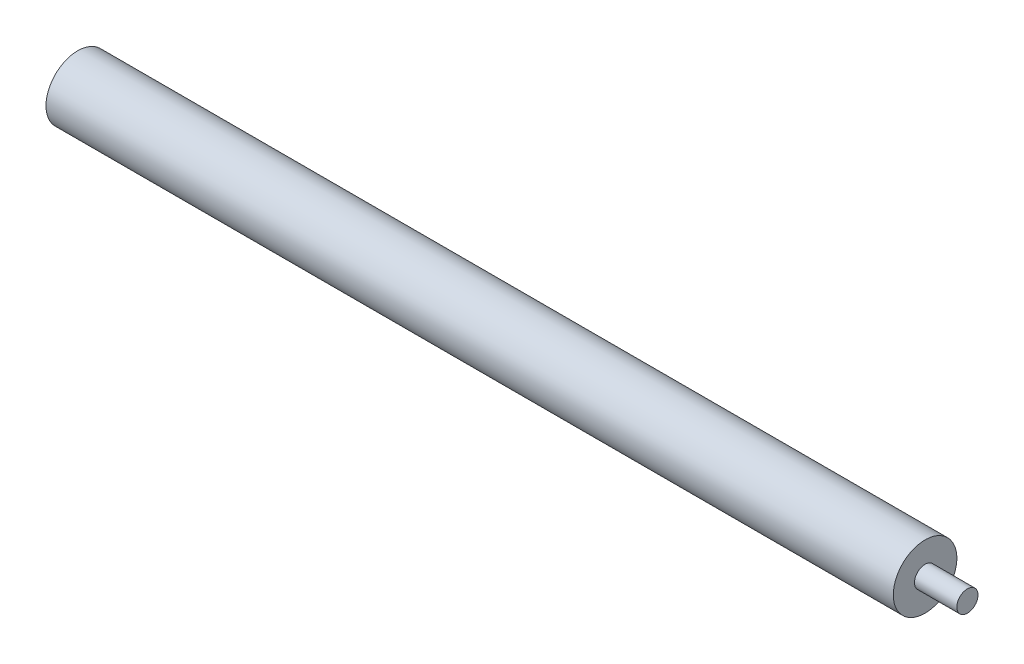
ISO-10303-21;
HEADER;
FILE_DESCRIPTION(('STEP AP214'),'2;1');
FILE_NAME('part.step','',(''),(''),'','','');
FILE_SCHEMA(('AUTOMOTIVE_DESIGN { 1 0 10303 214 1 1 1 1 }'));
ENDSEC;
DATA;
#1=APPLICATION_CONTEXT('core data for automotive mechanical design processes');
#2=APPLICATION_PROTOCOL_DEFINITION('international standard','automotive_design',2000,#1);
#3=PRODUCT_CONTEXT('',#1,'mechanical');
#4=PRODUCT('Part','Part','',(#3));
#5=PRODUCT_RELATED_PRODUCT_CATEGORY('part','',(#4));
#6=PRODUCT_DEFINITION_FORMATION('','',#4);
#7=PRODUCT_DEFINITION_CONTEXT('part definition',#1,'design');
#8=PRODUCT_DEFINITION('design','',#6,#7);
#9=PRODUCT_DEFINITION_SHAPE('','',#8);
#10=(LENGTH_UNIT() NAMED_UNIT(*) SI_UNIT(.MILLI.,.METRE.));
#11=(NAMED_UNIT(*) PLANE_ANGLE_UNIT() SI_UNIT($,.RADIAN.));
#12=(NAMED_UNIT(*) SI_UNIT($,.STERADIAN.) SOLID_ANGLE_UNIT());
#13=UNCERTAINTY_MEASURE_WITH_UNIT(LENGTH_MEASURE(1.E-05),#10,'distance_accuracy_value','');
#14=(GEOMETRIC_REPRESENTATION_CONTEXT(3) GLOBAL_UNCERTAINTY_ASSIGNED_CONTEXT((#13)) GLOBAL_UNIT_ASSIGNED_CONTEXT((#10,
#11,#12)) REPRESENTATION_CONTEXT('',''));
#15=CARTESIAN_POINT('',(0.,0.,0.));
#16=DIRECTION('',(0.,0.,1.));
#17=DIRECTION('',(1.,0.,0.));
#18=AXIS2_PLACEMENT_3D('',#15,#16,#17);
#19=CARTESIAN_POINT('',(-266.7,0.,0.));
#20=DIRECTION('',(1.,0.,0.));
#21=DIRECTION('',(0.,0.,-1.));
#22=AXIS2_PLACEMENT_3D('',#19,#20,#21);
#23=PLANE('',#22);
#24=CARTESIAN_POINT('',(-266.7,0.,0.));
#25=DIRECTION('',(-1.,0.,0.));
#26=DIRECTION('',(0.,0.,1.));
#27=AXIS2_PLACEMENT_3D('',#24,#25,#26);
#28=CIRCLE('',#27,0.79375);
#29=CARTESIAN_POINT('',(-266.7,0.,0.79375));
#30=VERTEX_POINT('',#29);
#31=EDGE_CURVE('E75',#30,#30,#28,.T.);
#32=ORIENTED_EDGE('',*,*,#31,.F.);
#33=EDGE_LOOP('',(#32));
#34=FACE_BOUND('',#33,.T.);
#35=CARTESIAN_POINT('',(-266.7,0.,0.));
#36=DIRECTION('',(-1.,0.,0.));
#37=DIRECTION('',(0.,0.,1.));
#38=AXIS2_PLACEMENT_3D('',#35,#36,#37);
#39=CIRCLE('',#38,9.525);
#40=CARTESIAN_POINT('',(-266.7,0.,9.525));
#41=VERTEX_POINT('',#40);
#42=EDGE_CURVE('E12',#41,#41,#39,.T.);
#43=ORIENTED_EDGE('',*,*,#42,.T.);
#44=EDGE_LOOP('',(#43));
#45=FACE_BOUND('',#44,.T.);
#46=ADVANCED_FACE('F49',(#34,#45),#23,.F.);
#47=CARTESIAN_POINT('',(-54.166265060241,0.,0.));
#48=DIRECTION('',(-1.,0.,0.));
#49=DIRECTION('',(0.,0.,1.));
#50=AXIS2_PLACEMENT_3D('',#47,#48,#49);
#51=CYLINDRICAL_SURFACE('',#50,9.525);
#52=ORIENTED_EDGE('',*,*,#42,.F.);
#53=EDGE_LOOP('',(#52));
#54=FACE_BOUND('',#53,.T.);
#55=CARTESIAN_POINT('',(-12.7,0.,0.));
#56=DIRECTION('',(-1.,0.,0.));
#57=DIRECTION('',(0.,0.,1.));
#58=AXIS2_PLACEMENT_3D('',#55,#56,#57);
#59=CIRCLE('',#58,9.525);
#60=CARTESIAN_POINT('',(-12.7,0.,9.525));
#61=VERTEX_POINT('',#60);
#62=EDGE_CURVE('E56',#61,#61,#59,.T.);
#63=ORIENTED_EDGE('',*,*,#62,.T.);
#64=EDGE_LOOP('',(#63));
#65=FACE_BOUND('',#64,.T.);
#66=ADVANCED_FACE('F94',(#54,#65),#51,.T.);
#67=CARTESIAN_POINT('',(-12.7,9.525,0.));
#68=DIRECTION('',(-1.,0.,0.));
#69=DIRECTION('',(0.,0.,1.));
#70=AXIS2_PLACEMENT_3D('',#67,#68,#69);
#71=PLANE('',#70);
#72=ORIENTED_EDGE('',*,*,#62,.F.);
#73=EDGE_LOOP('',(#72));
#74=FACE_BOUND('',#73,.T.);
#75=CARTESIAN_POINT('',(-12.7,0.,0.));
#76=DIRECTION('',(-1.,0.,0.));
#77=DIRECTION('',(0.,0.,1.));
#78=AXIS2_PLACEMENT_3D('',#75,#76,#77);
#79=CIRCLE('',#78,3.175);
#80=CARTESIAN_POINT('',(-12.7,0.,3.175));
#81=VERTEX_POINT('',#80);
#82=EDGE_CURVE('E62',#81,#81,#79,.T.);
#83=ORIENTED_EDGE('',*,*,#82,.T.);
#84=EDGE_LOOP('',(#83));
#85=FACE_BOUND('',#84,.T.);
#86=ADVANCED_FACE('F98',(#74,#85),#71,.F.);
#87=CARTESIAN_POINT('',(-54.166265060241,0.,0.));
#88=DIRECTION('',(-1.,0.,0.));
#89=DIRECTION('',(0.,0.,1.));
#90=AXIS2_PLACEMENT_3D('',#87,#88,#89);
#91=CYLINDRICAL_SURFACE('',#90,3.175);
#92=ORIENTED_EDGE('',*,*,#82,.F.);
#93=EDGE_LOOP('',(#92));
#94=FACE_BOUND('',#93,.T.);
#95=CARTESIAN_POINT('',(0.,0.,0.));
#96=DIRECTION('',(-1.,0.,0.));
#97=DIRECTION('',(0.,0.,1.));
#98=AXIS2_PLACEMENT_3D('',#95,#96,#97);
#99=CIRCLE('',#98,3.175);
#100=CARTESIAN_POINT('',(0.,0.,3.175));
#101=VERTEX_POINT('',#100);
#102=EDGE_CURVE('E68',#101,#101,#99,.T.);
#103=ORIENTED_EDGE('',*,*,#102,.T.);
#104=EDGE_LOOP('',(#103));
#105=FACE_BOUND('',#104,.T.);
#106=ADVANCED_FACE('F103',(#94,#105),#91,.T.);
#107=CARTESIAN_POINT('',(0.,3.175,0.));
#108=DIRECTION('',(-1.,0.,0.));
#109=DIRECTION('',(0.,0.,1.));
#110=AXIS2_PLACEMENT_3D('',#107,#108,#109);
#111=PLANE('',#110);
#112=ORIENTED_EDGE('',*,*,#102,.F.);
#113=EDGE_LOOP('',(#112));
#114=FACE_BOUND('',#113,.T.);
#115=ADVANCED_FACE('F89',(#114),#111,.F.);
#116=CARTESIAN_POINT('',(-254.,0.,0.));
#117=DIRECTION('',(-1.,0.,0.));
#118=DIRECTION('',(0.,0.,1.));
#119=AXIS2_PLACEMENT_3D('',#116,#117,#118);
#120=CYLINDRICAL_SURFACE('',#119,0.79375);
#121=CARTESIAN_POINT('',(-254.,0.,0.));
#122=DIRECTION('',(-1.,0.,0.));
#123=DIRECTION('',(0.,0.,1.));
#124=AXIS2_PLACEMENT_3D('',#121,#122,#123);
#125=CIRCLE('',#124,0.79375);
#126=CARTESIAN_POINT('',(-254.,0.,0.79375));
#127=VERTEX_POINT('',#126);
#128=EDGE_CURVE('E74',#127,#127,#125,.T.);
#129=ORIENTED_EDGE('',*,*,#128,.F.);
#130=EDGE_LOOP('',(#129));
#131=FACE_BOUND('',#130,.T.);
#132=ORIENTED_EDGE('',*,*,#31,.T.);
#133=EDGE_LOOP('',(#132));
#134=FACE_BOUND('',#133,.T.);
#135=ADVANCED_FACE('F86',(#131,#134),#120,.F.);
#136=CARTESIAN_POINT('',(-254.,0.,0.));
#137=DIRECTION('',(-1.,0.,0.));
#138=DIRECTION('',(0.,0.,1.));
#139=AXIS2_PLACEMENT_3D('',#136,#137,#138);
#140=PLANE('',#139);
#141=ORIENTED_EDGE('',*,*,#128,.T.);
#142=EDGE_LOOP('',(#141));
#143=FACE_BOUND('',#142,.T.);
#144=ADVANCED_FACE('F84',(#143),#140,.T.);
#145=CLOSED_SHELL('',(#46,#66,#86,#106,#115,#135,#144));
#146=MANIFOLD_SOLID_BREP('B2',#145);
#147=ADVANCED_BREP_SHAPE_REPRESENTATION('',(#18,#146),#14);
#148=SHAPE_DEFINITION_REPRESENTATION(#9,#147);
ENDSEC;
END-ISO-10303-21;
